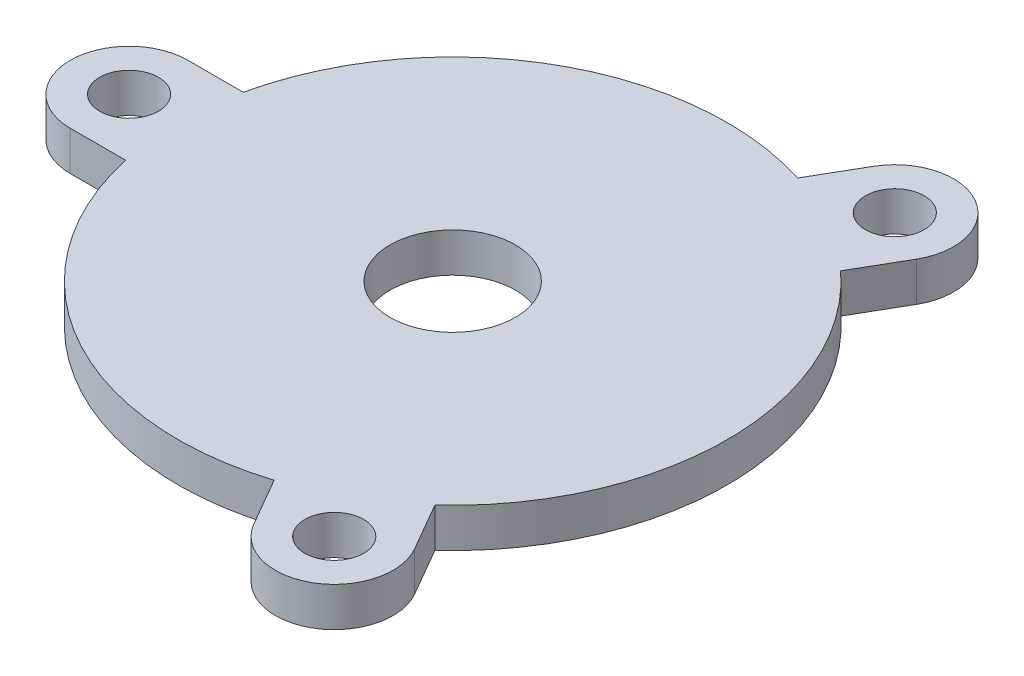
ISO-10303-21;
HEADER;
FILE_DESCRIPTION(('STEP AP214'),'2;1');
FILE_NAME('part.step','',(''),(''),'','','');
FILE_SCHEMA(('AUTOMOTIVE_DESIGN { 1 0 10303 214 1 1 1 1 }'));
ENDSEC;
DATA;
#1=APPLICATION_CONTEXT('core data for automotive mechanical design processes');
#2=APPLICATION_PROTOCOL_DEFINITION('international standard','automotive_design',2000,#1);
#3=PRODUCT_CONTEXT('',#1,'mechanical');
#4=PRODUCT('Part','Part','',(#3));
#5=PRODUCT_RELATED_PRODUCT_CATEGORY('part','',(#4));
#6=PRODUCT_DEFINITION_FORMATION('','',#4);
#7=PRODUCT_DEFINITION_CONTEXT('part definition',#1,'design');
#8=PRODUCT_DEFINITION('design','',#6,#7);
#9=PRODUCT_DEFINITION_SHAPE('','',#8);
#10=(LENGTH_UNIT() NAMED_UNIT(*) SI_UNIT(.MILLI.,.METRE.));
#11=(NAMED_UNIT(*) PLANE_ANGLE_UNIT() SI_UNIT($,.RADIAN.));
#12=(NAMED_UNIT(*) SI_UNIT($,.STERADIAN.) SOLID_ANGLE_UNIT());
#13=UNCERTAINTY_MEASURE_WITH_UNIT(LENGTH_MEASURE(1.E-05),#10,'distance_accuracy_value','');
#14=(GEOMETRIC_REPRESENTATION_CONTEXT(3) GLOBAL_UNCERTAINTY_ASSIGNED_CONTEXT((#13)) GLOBAL_UNIT_ASSIGNED_CONTEXT((#10,
#11,#12)) REPRESENTATION_CONTEXT('',''));
#15=CARTESIAN_POINT('',(0.,0.,0.));
#16=DIRECTION('',(0.,0.,1.));
#17=DIRECTION('',(1.,0.,0.));
#18=AXIS2_PLACEMENT_3D('',#15,#16,#17);
#19=CARTESIAN_POINT('',(2.59807621135332,2.,1.5));
#20=DIRECTION('',(0.866025403784439,0.,0.499999999999999));
#21=DIRECTION('',(0.5,0.,-0.866025403784439));
#22=AXIS2_PLACEMENT_3D('',#19,#20,#21);
#23=PLANE('',#22);
#24=DIRECTION('',(-0.5,0.,0.866025403784439));
#25=VECTOR('',#24,1.);
#26=CARTESIAN_POINT('',(2.59807621135332,0.,1.5));
#27=LINE('',#26,#25);
#28=CARTESIAN_POINT('',(10.8480762113533,0.,-12.7894191624432));
#29=VERTEX_POINT('',#28);
#30=CARTESIAN_POINT('',(9.43547337694199,0.,-10.342719282327));
#31=VERTEX_POINT('',#30);
#32=EDGE_CURVE('E168',#29,#31,#27,.T.);
#33=ORIENTED_EDGE('',*,*,#32,.F.);
#34=DIRECTION('',(0.,-1.,0.));
#35=VECTOR('',#34,1.);
#36=CARTESIAN_POINT('',(10.8480762113533,2.,-12.7894191624432));
#37=LINE('',#36,#35);
#38=CARTESIAN_POINT('',(10.8480762113533,2.,-12.7894191624432));
#39=VERTEX_POINT('',#38);
#40=EDGE_CURVE('E11',#39,#29,#37,.T.);
#41=ORIENTED_EDGE('',*,*,#40,.F.);
#42=DIRECTION('',(-0.5,0.,0.866025403784439));
#43=VECTOR('',#42,1.);
#44=CARTESIAN_POINT('',(2.59807621135332,2.,1.5));
#45=LINE('',#44,#43);
#46=CARTESIAN_POINT('',(9.43547337694199,2.,-10.342719282327));
#47=VERTEX_POINT('',#46);
#48=EDGE_CURVE('E207',#39,#47,#45,.T.);
#49=ORIENTED_EDGE('',*,*,#48,.T.);
#50=DIRECTION('',(0.,-1.,0.));
#51=VECTOR('',#50,1.);
#52=CARTESIAN_POINT('',(9.43547337694199,2.,-10.342719282327));
#53=LINE('',#52,#51);
#54=EDGE_CURVE('E102',#47,#31,#53,.T.);
#55=ORIENTED_EDGE('',*,*,#54,.T.);
#56=EDGE_LOOP('',(#33,#41,#49,#55));
#57=FACE_BOUND('',#56,.T.);
#58=ADVANCED_FACE('F39',(#57),#23,.T.);
#59=CARTESIAN_POINT('',(8.25,2.,-14.2894191624432));
#60=DIRECTION('',(0.,-1.,0.));
#61=DIRECTION('',(0.,0.,-1.));
#62=AXIS2_PLACEMENT_3D('',#59,#60,#61);
#63=CYLINDRICAL_SURFACE('',#62,3.);
#64=CARTESIAN_POINT('',(8.25,0.,-14.2894191624432));
#65=DIRECTION('',(0.,1.,0.));
#66=DIRECTION('',(0.,0.,1.));
#67=AXIS2_PLACEMENT_3D('',#64,#65,#66);
#68=CIRCLE('',#67,3.);
#69=CARTESIAN_POINT('',(5.65192378864668,0.,-15.7894191624432));
#70=VERTEX_POINT('',#69);
#71=EDGE_CURVE('E171',#29,#70,#68,.T.);
#72=ORIENTED_EDGE('',*,*,#71,.T.);
#73=DIRECTION('',(0.,-1.,0.));
#74=VECTOR('',#73,1.);
#75=CARTESIAN_POINT('',(5.65192378864668,2.,-15.7894191624432));
#76=LINE('',#75,#74);
#77=CARTESIAN_POINT('',(5.65192378864668,2.,-15.7894191624432));
#78=VERTEX_POINT('',#77);
#79=EDGE_CURVE('E47',#78,#70,#76,.T.);
#80=ORIENTED_EDGE('',*,*,#79,.F.);
#81=CARTESIAN_POINT('',(8.25,2.,-14.2894191624432));
#82=DIRECTION('',(0.,1.,0.));
#83=DIRECTION('',(0.,0.,1.));
#84=AXIS2_PLACEMENT_3D('',#81,#82,#83);
#85=CIRCLE('',#84,3.);
#86=EDGE_CURVE('E252',#39,#78,#85,.T.);
#87=ORIENTED_EDGE('',*,*,#86,.F.);
#88=ORIENTED_EDGE('',*,*,#40,.T.);
#89=EDGE_LOOP('',(#72,#80,#87,#88));
#90=FACE_BOUND('',#89,.T.);
#91=ADVANCED_FACE('F269',(#90),#63,.T.);
#92=CARTESIAN_POINT('',(-2.59807621135332,2.,-1.5));
#93=DIRECTION('',(0.866025403784438,0.,0.5));
#94=DIRECTION('',(0.5,0.,-0.866025403784439));
#95=AXIS2_PLACEMENT_3D('',#92,#93,#94);
#96=PLANE('',#95);
#97=DIRECTION('',(-0.5,0.,0.866025403784439));
#98=VECTOR('',#97,1.);
#99=CARTESIAN_POINT('',(-2.59807621135332,0.,-1.5));
#100=LINE('',#99,#98);
#101=CARTESIAN_POINT('',(4.23932095423535,0.,-13.342719282327));
#102=VERTEX_POINT('',#101);
#103=EDGE_CURVE('E173',#70,#102,#100,.T.);
#104=ORIENTED_EDGE('',*,*,#103,.T.);
#105=DIRECTION('',(0.,-1.,0.));
#106=VECTOR('',#105,1.);
#107=CARTESIAN_POINT('',(4.23932095423535,2.,-13.342719282327));
#108=LINE('',#107,#106);
#109=CARTESIAN_POINT('',(4.23932095423535,2.,-13.342719282327));
#110=VERTEX_POINT('',#109);
#111=EDGE_CURVE('E223',#110,#102,#108,.T.);
#112=ORIENTED_EDGE('',*,*,#111,.F.);
#113=DIRECTION('',(-0.5,0.,0.866025403784439));
#114=VECTOR('',#113,1.);
#115=CARTESIAN_POINT('',(-2.59807621135332,2.,-1.5));
#116=LINE('',#115,#114);
#117=EDGE_CURVE('E232',#78,#110,#116,.T.);
#118=ORIENTED_EDGE('',*,*,#117,.F.);
#119=ORIENTED_EDGE('',*,*,#79,.T.);
#120=EDGE_LOOP('',(#104,#112,#118,#119));
#121=FACE_BOUND('',#120,.T.);
#122=ADVANCED_FACE('F230',(#121),#96,.F.);
#123=CARTESIAN_POINT('',(0.,2.,0.));
#124=DIRECTION('',(0.,-1.,0.));
#125=DIRECTION('',(0.,0.,-1.));
#126=AXIS2_PLACEMENT_3D('',#123,#124,#125);
#127=CYLINDRICAL_SURFACE('',#126,14.);
#128=CARTESIAN_POINT('',(0.,0.,0.));
#129=DIRECTION('',(0.,1.,0.));
#130=DIRECTION('',(0.,0.,1.));
#131=AXIS2_PLACEMENT_3D('',#128,#129,#130);
#132=CIRCLE('',#131,14.);
#133=CARTESIAN_POINT('',(-13.6747943311773,0.,-3.));
#134=VERTEX_POINT('',#133);
#135=EDGE_CURVE('E175',#102,#134,#132,.T.);
#136=ORIENTED_EDGE('',*,*,#135,.T.);
#137=DIRECTION('',(0.,-1.,0.));
#138=VECTOR('',#137,1.);
#139=CARTESIAN_POINT('',(-13.6747943311773,2.,-3.));
#140=LINE('',#139,#138);
#141=CARTESIAN_POINT('',(-13.6747943311773,2.,-3.));
#142=VERTEX_POINT('',#141);
#143=EDGE_CURVE('E221',#142,#134,#140,.T.);
#144=ORIENTED_EDGE('',*,*,#143,.F.);
#145=CARTESIAN_POINT('',(0.,2.,0.));
#146=DIRECTION('',(0.,1.,0.));
#147=DIRECTION('',(0.,0.,1.));
#148=AXIS2_PLACEMENT_3D('',#145,#146,#147);
#149=CIRCLE('',#148,14.);
#150=EDGE_CURVE('E246',#110,#142,#149,.T.);
#151=ORIENTED_EDGE('',*,*,#150,.F.);
#152=ORIENTED_EDGE('',*,*,#111,.T.);
#153=EDGE_LOOP('',(#136,#144,#151,#152));
#154=FACE_BOUND('',#153,.T.);
#155=ADVANCED_FACE('F243',(#154),#127,.T.);
#156=CARTESIAN_POINT('',(0.,2.,-3.));
#157=DIRECTION('',(0.,0.,-1.));
#158=DIRECTION('',(-1.,0.,0.));
#159=AXIS2_PLACEMENT_3D('',#156,#157,#158);
#160=PLANE('',#159);
#161=DIRECTION('',(1.,0.,0.));
#162=VECTOR('',#161,1.);
#163=CARTESIAN_POINT('',(0.,0.,-3.));
#164=LINE('',#163,#162);
#165=CARTESIAN_POINT('',(-16.5,0.,-3.));
#166=VERTEX_POINT('',#165);
#167=EDGE_CURVE('E178',#166,#134,#164,.T.);
#168=ORIENTED_EDGE('',*,*,#167,.F.);
#169=DIRECTION('',(0.,-1.,0.));
#170=VECTOR('',#169,1.);
#171=CARTESIAN_POINT('',(-16.5,2.,-3.));
#172=LINE('',#171,#170);
#173=CARTESIAN_POINT('',(-16.5,2.,-3.));
#174=VERTEX_POINT('',#173);
#175=EDGE_CURVE('E219',#174,#166,#172,.T.);
#176=ORIENTED_EDGE('',*,*,#175,.F.);
#177=DIRECTION('',(1.,0.,0.));
#178=VECTOR('',#177,1.);
#179=CARTESIAN_POINT('',(0.,2.,-3.));
#180=LINE('',#179,#178);
#181=EDGE_CURVE('E248',#174,#142,#180,.T.);
#182=ORIENTED_EDGE('',*,*,#181,.T.);
#183=ORIENTED_EDGE('',*,*,#143,.T.);
#184=EDGE_LOOP('',(#168,#176,#182,#183));
#185=FACE_BOUND('',#184,.T.);
#186=ADVANCED_FACE('F279',(#185),#160,.T.);
#187=CARTESIAN_POINT('',(-16.5,2.,0.));
#188=DIRECTION('',(0.,-1.,0.));
#189=DIRECTION('',(0.,0.,-1.));
#190=AXIS2_PLACEMENT_3D('',#187,#188,#189);
#191=CYLINDRICAL_SURFACE('',#190,3.);
#192=CARTESIAN_POINT('',(-16.5,0.,0.));
#193=DIRECTION('',(0.,1.,0.));
#194=DIRECTION('',(0.,0.,1.));
#195=AXIS2_PLACEMENT_3D('',#192,#193,#194);
#196=CIRCLE('',#195,3.);
#197=CARTESIAN_POINT('',(-16.5,0.,3.));
#198=VERTEX_POINT('',#197);
#199=EDGE_CURVE('E181',#166,#198,#196,.T.);
#200=ORIENTED_EDGE('',*,*,#199,.T.);
#201=DIRECTION('',(0.,-1.,0.));
#202=VECTOR('',#201,1.);
#203=CARTESIAN_POINT('',(-16.5,2.,3.));
#204=LINE('',#203,#202);
#205=CARTESIAN_POINT('',(-16.5,2.,3.));
#206=VERTEX_POINT('',#205);
#207=EDGE_CURVE('E216',#206,#198,#204,.T.);
#208=ORIENTED_EDGE('',*,*,#207,.F.);
#209=CARTESIAN_POINT('',(-16.5,2.,0.));
#210=DIRECTION('',(0.,1.,0.));
#211=DIRECTION('',(0.,0.,1.));
#212=AXIS2_PLACEMENT_3D('',#209,#210,#211);
#213=CIRCLE('',#212,3.);
#214=EDGE_CURVE('E250',#174,#206,#213,.T.);
#215=ORIENTED_EDGE('',*,*,#214,.F.);
#216=ORIENTED_EDGE('',*,*,#175,.T.);
#217=EDGE_LOOP('',(#200,#208,#215,#216));
#218=FACE_BOUND('',#217,.T.);
#219=ADVANCED_FACE('F282',(#218),#191,.T.);
#220=CARTESIAN_POINT('',(0.,2.,3.));
#221=DIRECTION('',(0.,0.,-1.));
#222=DIRECTION('',(-1.,0.,0.));
#223=AXIS2_PLACEMENT_3D('',#220,#221,#222);
#224=PLANE('',#223);
#225=DIRECTION('',(1.,0.,0.));
#226=VECTOR('',#225,1.);
#227=CARTESIAN_POINT('',(0.,0.,3.));
#228=LINE('',#227,#226);
#229=CARTESIAN_POINT('',(-13.6747943311773,0.,3.));
#230=VERTEX_POINT('',#229);
#231=EDGE_CURVE('E183',#198,#230,#228,.T.);
#232=ORIENTED_EDGE('',*,*,#231,.T.);
#233=DIRECTION('',(0.,-1.,0.));
#234=VECTOR('',#233,1.);
#235=CARTESIAN_POINT('',(-13.6747943311773,2.,3.));
#236=LINE('',#235,#234);
#237=CARTESIAN_POINT('',(-13.6747943311773,2.,3.));
#238=VERTEX_POINT('',#237);
#239=EDGE_CURVE('E213',#238,#230,#236,.T.);
#240=ORIENTED_EDGE('',*,*,#239,.F.);
#241=DIRECTION('',(1.,0.,0.));
#242=VECTOR('',#241,1.);
#243=CARTESIAN_POINT('',(0.,2.,3.));
#244=LINE('',#243,#242);
#245=EDGE_CURVE('E257',#206,#238,#244,.T.);
#246=ORIENTED_EDGE('',*,*,#245,.F.);
#247=ORIENTED_EDGE('',*,*,#207,.T.);
#248=EDGE_LOOP('',(#232,#240,#246,#247));
#249=FACE_BOUND('',#248,.T.);
#250=ADVANCED_FACE('F286',(#249),#224,.F.);
#251=CARTESIAN_POINT('',(0.,2.,0.));
#252=DIRECTION('',(0.,-1.,0.));
#253=DIRECTION('',(0.,0.,-1.));
#254=AXIS2_PLACEMENT_3D('',#251,#252,#253);
#255=CYLINDRICAL_SURFACE('',#254,14.);
#256=CARTESIAN_POINT('',(0.,0.,0.));
#257=DIRECTION('',(0.,1.,0.));
#258=DIRECTION('',(0.,0.,1.));
#259=AXIS2_PLACEMENT_3D('',#256,#257,#258);
#260=CIRCLE('',#259,14.);
#261=CARTESIAN_POINT('',(4.23932095423536,0.,13.342719282327));
#262=VERTEX_POINT('',#261);
#263=EDGE_CURVE('E185',#230,#262,#260,.T.);
#264=ORIENTED_EDGE('',*,*,#263,.T.);
#265=DIRECTION('',(0.,-1.,0.));
#266=VECTOR('',#265,1.);
#267=CARTESIAN_POINT('',(4.23932095423536,2.,13.342719282327));
#268=LINE('',#267,#266);
#269=CARTESIAN_POINT('',(4.23932095423536,2.,13.342719282327));
#270=VERTEX_POINT('',#269);
#271=EDGE_CURVE('E211',#270,#262,#268,.T.);
#272=ORIENTED_EDGE('',*,*,#271,.F.);
#273=CARTESIAN_POINT('',(0.,2.,0.));
#274=DIRECTION('',(0.,1.,0.));
#275=DIRECTION('',(0.,0.,1.));
#276=AXIS2_PLACEMENT_3D('',#273,#274,#275);
#277=CIRCLE('',#276,14.);
#278=EDGE_CURVE('E259',#238,#270,#277,.T.);
#279=ORIENTED_EDGE('',*,*,#278,.F.);
#280=ORIENTED_EDGE('',*,*,#239,.T.);
#281=EDGE_LOOP('',(#264,#272,#279,#280));
#282=FACE_BOUND('',#281,.T.);
#283=ADVANCED_FACE('F290',(#282),#255,.T.);
#284=CARTESIAN_POINT('',(-2.59807621135332,2.,1.5));
#285=DIRECTION('',(-0.866025403784438,0.,0.5));
#286=DIRECTION('',(0.5,0.,0.866025403784438));
#287=AXIS2_PLACEMENT_3D('',#284,#285,#286);
#288=PLANE('',#287);
#289=DIRECTION('',(-0.5,0.,-0.866025403784438));
#290=VECTOR('',#289,1.);
#291=CARTESIAN_POINT('',(-2.59807621135332,0.,1.5));
#292=LINE('',#291,#290);
#293=CARTESIAN_POINT('',(5.65192378864669,0.,15.7894191624432));
#294=VERTEX_POINT('',#293);
#295=EDGE_CURVE('E188',#294,#262,#292,.T.);
#296=ORIENTED_EDGE('',*,*,#295,.F.);
#297=DIRECTION('',(0.,-1.,0.));
#298=VECTOR('',#297,1.);
#299=CARTESIAN_POINT('',(5.65192378864669,2.,15.7894191624432));
#300=LINE('',#299,#298);
#301=CARTESIAN_POINT('',(5.65192378864669,2.,15.7894191624432));
#302=VERTEX_POINT('',#301);
#303=EDGE_CURVE('E148',#302,#294,#300,.T.);
#304=ORIENTED_EDGE('',*,*,#303,.F.);
#305=DIRECTION('',(-0.5,0.,-0.866025403784438));
#306=VECTOR('',#305,1.);
#307=CARTESIAN_POINT('',(-2.59807621135332,2.,1.5));
#308=LINE('',#307,#306);
#309=EDGE_CURVE('E141',#302,#270,#308,.T.);
#310=ORIENTED_EDGE('',*,*,#309,.T.);
#311=ORIENTED_EDGE('',*,*,#271,.T.);
#312=EDGE_LOOP('',(#296,#304,#310,#311));
#313=FACE_BOUND('',#312,.T.);
#314=ADVANCED_FACE('F262',(#313),#288,.T.);
#315=CARTESIAN_POINT('',(8.25000000000001,2.,14.2894191624432));
#316=DIRECTION('',(0.,-1.,0.));
#317=DIRECTION('',(0.,0.,-1.));
#318=AXIS2_PLACEMENT_3D('',#315,#316,#317);
#319=CYLINDRICAL_SURFACE('',#318,3.);
#320=CARTESIAN_POINT('',(8.25000000000001,0.,14.2894191624432));
#321=DIRECTION('',(0.,1.,0.));
#322=DIRECTION('',(0.,0.,1.));
#323=AXIS2_PLACEMENT_3D('',#320,#321,#322);
#324=CIRCLE('',#323,3.);
#325=CARTESIAN_POINT('',(10.8480762113533,0.,12.7894191624432));
#326=VERTEX_POINT('',#325);
#327=EDGE_CURVE('E147',#294,#326,#324,.T.);
#328=ORIENTED_EDGE('',*,*,#327,.T.);
#329=DIRECTION('',(0.,-1.,0.));
#330=VECTOR('',#329,1.);
#331=CARTESIAN_POINT('',(10.8480762113533,2.,12.7894191624432));
#332=LINE('',#331,#330);
#333=CARTESIAN_POINT('',(10.8480762113533,2.,12.7894191624432));
#334=VERTEX_POINT('',#333);
#335=EDGE_CURVE('E144',#334,#326,#332,.T.);
#336=ORIENTED_EDGE('',*,*,#335,.F.);
#337=CARTESIAN_POINT('',(8.25000000000001,2.,14.2894191624432));
#338=DIRECTION('',(0.,1.,0.));
#339=DIRECTION('',(0.,0.,1.));
#340=AXIS2_PLACEMENT_3D('',#337,#338,#339);
#341=CIRCLE('',#340,3.);
#342=EDGE_CURVE('E134',#302,#334,#341,.T.);
#343=ORIENTED_EDGE('',*,*,#342,.F.);
#344=ORIENTED_EDGE('',*,*,#303,.T.);
#345=EDGE_LOOP('',(#328,#336,#343,#344));
#346=FACE_BOUND('',#345,.T.);
#347=ADVANCED_FACE('F145',(#346),#319,.T.);
#348=CARTESIAN_POINT('',(2.59807621135332,2.,-1.5));
#349=DIRECTION('',(-0.866025403784439,0.,0.5));
#350=DIRECTION('',(0.5,0.,0.866025403784439));
#351=AXIS2_PLACEMENT_3D('',#348,#349,#350);
#352=PLANE('',#351);
#353=DIRECTION('',(-0.5,0.,-0.866025403784439));
#354=VECTOR('',#353,1.);
#355=CARTESIAN_POINT('',(2.59807621135332,0.,-1.5));
#356=LINE('',#355,#354);
#357=CARTESIAN_POINT('',(9.43547337694199,0.,10.342719282327));
#358=VERTEX_POINT('',#357);
#359=EDGE_CURVE('E95',#326,#358,#356,.T.);
#360=ORIENTED_EDGE('',*,*,#359,.T.);
#361=DIRECTION('',(0.,-1.,0.));
#362=VECTOR('',#361,1.);
#363=CARTESIAN_POINT('',(9.43547337694199,2.,10.342719282327));
#364=LINE('',#363,#362);
#365=CARTESIAN_POINT('',(9.43547337694199,2.,10.342719282327));
#366=VERTEX_POINT('',#365);
#367=EDGE_CURVE('E149',#366,#358,#364,.T.);
#368=ORIENTED_EDGE('',*,*,#367,.F.);
#369=DIRECTION('',(-0.5,0.,-0.866025403784439));
#370=VECTOR('',#369,1.);
#371=CARTESIAN_POINT('',(2.59807621135332,2.,-1.5));
#372=LINE('',#371,#370);
#373=EDGE_CURVE('E139',#334,#366,#372,.T.);
#374=ORIENTED_EDGE('',*,*,#373,.F.);
#375=ORIENTED_EDGE('',*,*,#335,.T.);
#376=EDGE_LOOP('',(#360,#368,#374,#375));
#377=FACE_BOUND('',#376,.T.);
#378=ADVANCED_FACE('F151',(#377),#352,.F.);
#379=CARTESIAN_POINT('',(8.25,2.,-14.2894191624432));
#380=DIRECTION('',(0.,-1.,0.));
#381=DIRECTION('',(0.,0.,-1.));
#382=AXIS2_PLACEMENT_3D('',#379,#380,#381);
#383=CYLINDRICAL_SURFACE('',#382,1.5);
#384=CARTESIAN_POINT('',(8.25,2.,-14.2894191624432));
#385=DIRECTION('',(0.,1.,0.));
#386=DIRECTION('',(0.,0.,1.));
#387=AXIS2_PLACEMENT_3D('',#384,#385,#386);
#388=CIRCLE('',#387,1.5);
#389=CARTESIAN_POINT('',(8.25,2.,-12.7894191624432));
#390=VERTEX_POINT('',#389);
#391=EDGE_CURVE('E162',#390,#390,#388,.T.);
#392=ORIENTED_EDGE('',*,*,#391,.T.);
#393=EDGE_LOOP('',(#392));
#394=FACE_BOUND('',#393,.T.);
#395=CARTESIAN_POINT('',(8.25,0.,-14.2894191624432));
#396=DIRECTION('',(0.,1.,0.));
#397=DIRECTION('',(0.,0.,1.));
#398=AXIS2_PLACEMENT_3D('',#395,#396,#397);
#399=CIRCLE('',#398,1.5);
#400=CARTESIAN_POINT('',(8.25,0.,-12.7894191624432));
#401=VERTEX_POINT('',#400);
#402=EDGE_CURVE('E201',#401,#401,#399,.T.);
#403=ORIENTED_EDGE('',*,*,#402,.F.);
#404=EDGE_LOOP('',(#403));
#405=FACE_BOUND('',#404,.T.);
#406=ADVANCED_FACE('F301',(#394,#405),#383,.F.);
#407=CARTESIAN_POINT('',(-16.5,2.,0.));
#408=DIRECTION('',(0.,-1.,0.));
#409=DIRECTION('',(0.,0.,-1.));
#410=AXIS2_PLACEMENT_3D('',#407,#408,#409);
#411=CYLINDRICAL_SURFACE('',#410,1.5);
#412=CARTESIAN_POINT('',(-16.5,2.,0.));
#413=DIRECTION('',(0.,1.,0.));
#414=DIRECTION('',(0.,0.,1.));
#415=AXIS2_PLACEMENT_3D('',#412,#413,#414);
#416=CIRCLE('',#415,1.5);
#417=CARTESIAN_POINT('',(-16.5,2.,1.5));
#418=VERTEX_POINT('',#417);
#419=EDGE_CURVE('E159',#418,#418,#416,.T.);
#420=ORIENTED_EDGE('',*,*,#419,.T.);
#421=EDGE_LOOP('',(#420));
#422=FACE_BOUND('',#421,.T.);
#423=CARTESIAN_POINT('',(-16.5,0.,0.));
#424=DIRECTION('',(0.,1.,0.));
#425=DIRECTION('',(0.,0.,1.));
#426=AXIS2_PLACEMENT_3D('',#423,#424,#425);
#427=CIRCLE('',#426,1.5);
#428=CARTESIAN_POINT('',(-16.5,0.,1.5));
#429=VERTEX_POINT('',#428);
#430=EDGE_CURVE('E198',#429,#429,#427,.T.);
#431=ORIENTED_EDGE('',*,*,#430,.F.);
#432=EDGE_LOOP('',(#431));
#433=FACE_BOUND('',#432,.T.);
#434=ADVANCED_FACE('F308',(#422,#433),#411,.F.);
#435=CARTESIAN_POINT('',(0.,2.,0.));
#436=DIRECTION('',(0.,-1.,0.));
#437=DIRECTION('',(0.,0.,-1.));
#438=AXIS2_PLACEMENT_3D('',#435,#436,#437);
#439=CYLINDRICAL_SURFACE('',#438,3.2);
#440=CARTESIAN_POINT('',(0.,2.,0.));
#441=DIRECTION('',(0.,1.,0.));
#442=DIRECTION('',(0.,0.,1.));
#443=AXIS2_PLACEMENT_3D('',#440,#441,#442);
#444=CIRCLE('',#443,3.2);
#445=CARTESIAN_POINT('',(0.,2.,3.2));
#446=VERTEX_POINT('',#445);
#447=EDGE_CURVE('E153',#446,#446,#444,.T.);
#448=ORIENTED_EDGE('',*,*,#447,.T.);
#449=EDGE_LOOP('',(#448));
#450=FACE_BOUND('',#449,.T.);
#451=CARTESIAN_POINT('',(0.,0.,0.));
#452=DIRECTION('',(0.,1.,0.));
#453=DIRECTION('',(0.,0.,1.));
#454=AXIS2_PLACEMENT_3D('',#451,#452,#453);
#455=CIRCLE('',#454,3.2);
#456=CARTESIAN_POINT('',(0.,0.,3.2));
#457=VERTEX_POINT('',#456);
#458=EDGE_CURVE('E195',#457,#457,#455,.T.);
#459=ORIENTED_EDGE('',*,*,#458,.F.);
#460=EDGE_LOOP('',(#459));
#461=FACE_BOUND('',#460,.T.);
#462=ADVANCED_FACE('F305',(#450,#461),#439,.F.);
#463=CARTESIAN_POINT('',(0.,2.,0.));
#464=DIRECTION('',(0.,-1.,0.));
#465=DIRECTION('',(0.,0.,-1.));
#466=AXIS2_PLACEMENT_3D('',#463,#464,#465);
#467=CYLINDRICAL_SURFACE('',#466,14.);
#468=CARTESIAN_POINT('',(0.,0.,0.));
#469=DIRECTION('',(0.,1.,0.));
#470=DIRECTION('',(0.,0.,1.));
#471=AXIS2_PLACEMENT_3D('',#468,#469,#470);
#472=CIRCLE('',#471,14.);
#473=EDGE_CURVE('E193',#358,#31,#472,.T.);
#474=ORIENTED_EDGE('',*,*,#473,.T.);
#475=ORIENTED_EDGE('',*,*,#54,.F.);
#476=CARTESIAN_POINT('',(0.,2.,0.));
#477=DIRECTION('',(0.,1.,0.));
#478=DIRECTION('',(0.,0.,1.));
#479=AXIS2_PLACEMENT_3D('',#476,#477,#478);
#480=CIRCLE('',#479,14.);
#481=EDGE_CURVE('E55',#366,#47,#480,.T.);
#482=ORIENTED_EDGE('',*,*,#481,.F.);
#483=ORIENTED_EDGE('',*,*,#367,.T.);
#484=EDGE_LOOP('',(#474,#475,#482,#483));
#485=FACE_BOUND('',#484,.T.);
#486=ADVANCED_FACE('F267',(#485),#467,.T.);
#487=CARTESIAN_POINT('',(8.25000000000001,2.,14.2894191624432));
#488=DIRECTION('',(0.,-1.,0.));
#489=DIRECTION('',(0.,0.,-1.));
#490=AXIS2_PLACEMENT_3D('',#487,#488,#489);
#491=CYLINDRICAL_SURFACE('',#490,1.5);
#492=CARTESIAN_POINT('',(8.25000000000001,2.,14.2894191624432));
#493=DIRECTION('',(0.,1.,0.));
#494=DIRECTION('',(0.,0.,1.));
#495=AXIS2_PLACEMENT_3D('',#492,#493,#494);
#496=CIRCLE('',#495,1.5);
#497=CARTESIAN_POINT('',(8.25000000000001,2.,15.7894191624432));
#498=VERTEX_POINT('',#497);
#499=EDGE_CURVE('E165',#498,#498,#496,.T.);
#500=ORIENTED_EDGE('',*,*,#499,.T.);
#501=EDGE_LOOP('',(#500));
#502=FACE_BOUND('',#501,.T.);
#503=CARTESIAN_POINT('',(8.25000000000001,0.,14.2894191624432));
#504=DIRECTION('',(0.,1.,0.));
#505=DIRECTION('',(0.,0.,1.));
#506=AXIS2_PLACEMENT_3D('',#503,#504,#505);
#507=CIRCLE('',#506,1.5);
#508=CARTESIAN_POINT('',(8.25000000000001,0.,15.7894191624432));
#509=VERTEX_POINT('',#508);
#510=EDGE_CURVE('E204',#509,#509,#507,.T.);
#511=ORIENTED_EDGE('',*,*,#510,.F.);
#512=EDGE_LOOP('',(#511));
#513=FACE_BOUND('',#512,.T.);
#514=ADVANCED_FACE('F304',(#502,#513),#491,.F.);
#515=CARTESIAN_POINT('',(0.,2.,0.));
#516=DIRECTION('',(0.,1.,0.));
#517=DIRECTION('',(0.,0.,1.));
#518=AXIS2_PLACEMENT_3D('',#515,#516,#517);
#519=PLANE('',#518);
#520=ORIENTED_EDGE('',*,*,#48,.F.);
#521=ORIENTED_EDGE('',*,*,#86,.T.);
#522=ORIENTED_EDGE('',*,*,#117,.T.);
#523=ORIENTED_EDGE('',*,*,#150,.T.);
#524=ORIENTED_EDGE('',*,*,#181,.F.);
#525=ORIENTED_EDGE('',*,*,#214,.T.);
#526=ORIENTED_EDGE('',*,*,#245,.T.);
#527=ORIENTED_EDGE('',*,*,#278,.T.);
#528=ORIENTED_EDGE('',*,*,#309,.F.);
#529=ORIENTED_EDGE('',*,*,#342,.T.);
#530=ORIENTED_EDGE('',*,*,#373,.T.);
#531=ORIENTED_EDGE('',*,*,#481,.T.);
#532=EDGE_LOOP('',(#520,#521,#522,#523,#524,#525,#526,#527,#528,#529,#530,#531));
#533=FACE_BOUND('',#532,.T.);
#534=ORIENTED_EDGE('',*,*,#447,.F.);
#535=EDGE_LOOP('',(#534));
#536=FACE_BOUND('',#535,.T.);
#537=ORIENTED_EDGE('',*,*,#419,.F.);
#538=EDGE_LOOP('',(#537));
#539=FACE_BOUND('',#538,.T.);
#540=ORIENTED_EDGE('',*,*,#391,.F.);
#541=EDGE_LOOP('',(#540));
#542=FACE_BOUND('',#541,.T.);
#543=ORIENTED_EDGE('',*,*,#499,.F.);
#544=EDGE_LOOP('',(#543));
#545=FACE_BOUND('',#544,.T.);
#546=ADVANCED_FACE('F136',(#533,#536,#539,#542,#545),#519,.T.);
#547=CARTESIAN_POINT('',(0.,0.,0.));
#548=DIRECTION('',(0.,1.,0.));
#549=DIRECTION('',(0.,0.,1.));
#550=AXIS2_PLACEMENT_3D('',#547,#548,#549);
#551=PLANE('',#550);
#552=ORIENTED_EDGE('',*,*,#32,.T.);
#553=ORIENTED_EDGE('',*,*,#473,.F.);
#554=ORIENTED_EDGE('',*,*,#359,.F.);
#555=ORIENTED_EDGE('',*,*,#327,.F.);
#556=ORIENTED_EDGE('',*,*,#295,.T.);
#557=ORIENTED_EDGE('',*,*,#263,.F.);
#558=ORIENTED_EDGE('',*,*,#231,.F.);
#559=ORIENTED_EDGE('',*,*,#199,.F.);
#560=ORIENTED_EDGE('',*,*,#167,.T.);
#561=ORIENTED_EDGE('',*,*,#135,.F.);
#562=ORIENTED_EDGE('',*,*,#103,.F.);
#563=ORIENTED_EDGE('',*,*,#71,.F.);
#564=EDGE_LOOP('',(#552,#553,#554,#555,#556,#557,#558,#559,#560,#561,#562,#563));
#565=FACE_BOUND('',#564,.T.);
#566=ORIENTED_EDGE('',*,*,#458,.T.);
#567=EDGE_LOOP('',(#566));
#568=FACE_BOUND('',#567,.T.);
#569=ORIENTED_EDGE('',*,*,#430,.T.);
#570=EDGE_LOOP('',(#569));
#571=FACE_BOUND('',#570,.T.);
#572=ORIENTED_EDGE('',*,*,#402,.T.);
#573=EDGE_LOOP('',(#572));
#574=FACE_BOUND('',#573,.T.);
#575=ORIENTED_EDGE('',*,*,#510,.T.);
#576=EDGE_LOOP('',(#575));
#577=FACE_BOUND('',#576,.T.);
#578=ADVANCED_FACE('F237',(#565,#568,#571,#574,#577),#551,.F.);
#579=CLOSED_SHELL('',(#58,#91,#122,#155,#186,#219,#250,#283,#314,#347,#378,#406,#434,#462,#486,
#514,#546,#578));
#580=MANIFOLD_SOLID_BREP('B2',#579);
#581=ADVANCED_BREP_SHAPE_REPRESENTATION('',(#18,#580),#14);
#582=SHAPE_DEFINITION_REPRESENTATION(#9,#581);
ENDSEC;
END-ISO-10303-21;
